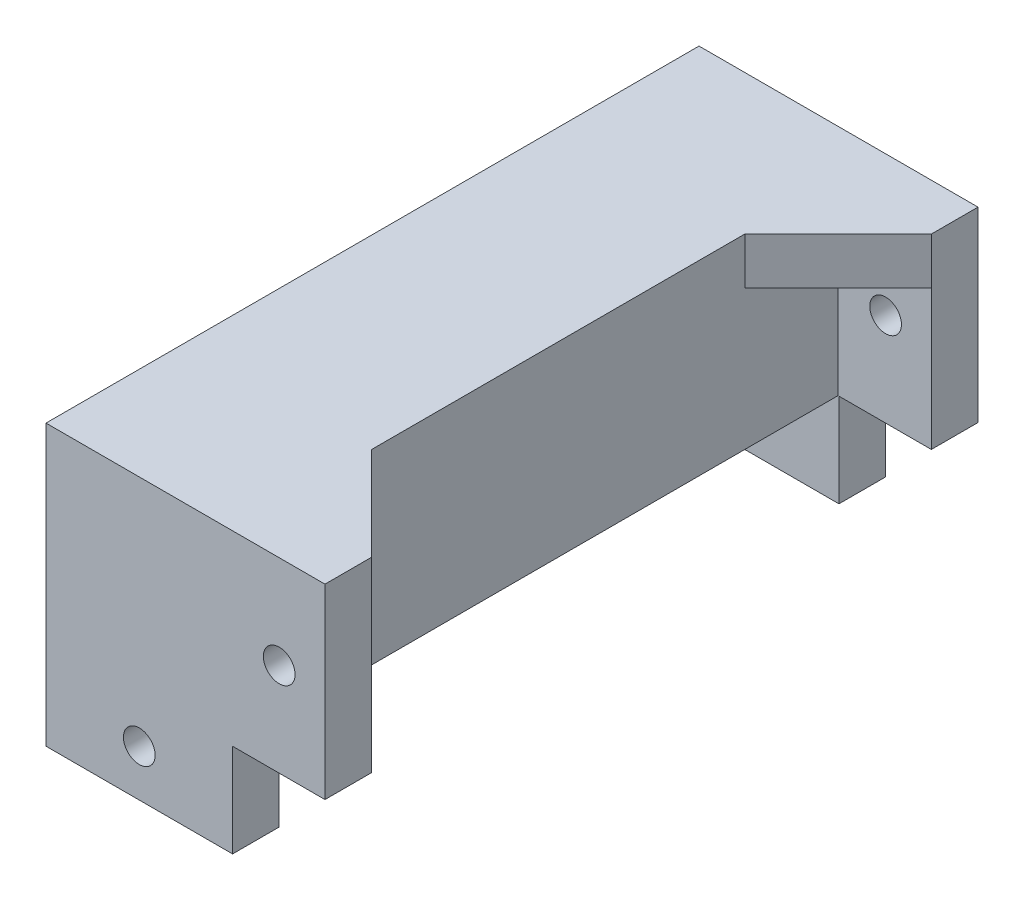
ISO-10303-21;
HEADER;
FILE_DESCRIPTION(('STEP AP214'),'2;1');
FILE_NAME('part.step','',(''),(''),'','','');
FILE_SCHEMA(('AUTOMOTIVE_DESIGN { 1 0 10303 214 1 1 1 1 }'));
ENDSEC;
DATA;
#1=APPLICATION_CONTEXT('core data for automotive mechanical design processes');
#2=APPLICATION_PROTOCOL_DEFINITION('international standard','automotive_design',2000,#1);
#3=PRODUCT_CONTEXT('',#1,'mechanical');
#4=PRODUCT('Part','Part','',(#3));
#5=PRODUCT_RELATED_PRODUCT_CATEGORY('part','',(#4));
#6=PRODUCT_DEFINITION_FORMATION('','',#4);
#7=PRODUCT_DEFINITION_CONTEXT('part definition',#1,'design');
#8=PRODUCT_DEFINITION('design','',#6,#7);
#9=PRODUCT_DEFINITION_SHAPE('','',#8);
#10=(LENGTH_UNIT() NAMED_UNIT(*) SI_UNIT(.MILLI.,.METRE.));
#11=(NAMED_UNIT(*) PLANE_ANGLE_UNIT() SI_UNIT($,.RADIAN.));
#12=(NAMED_UNIT(*) SI_UNIT($,.STERADIAN.) SOLID_ANGLE_UNIT());
#13=UNCERTAINTY_MEASURE_WITH_UNIT(LENGTH_MEASURE(1.E-05),#10,'distance_accuracy_value','');
#14=(GEOMETRIC_REPRESENTATION_CONTEXT(3) GLOBAL_UNCERTAINTY_ASSIGNED_CONTEXT((#13)) GLOBAL_UNIT_ASSIGNED_CONTEXT((#10,
#11,#12)) REPRESENTATION_CONTEXT('',''));
#15=CARTESIAN_POINT('',(0.,0.,0.));
#16=DIRECTION('',(0.,0.,1.));
#17=DIRECTION('',(1.,0.,0.));
#18=AXIS2_PLACEMENT_3D('',#15,#16,#17);
#19=CARTESIAN_POINT('',(-17.5534142595707,0.,311.476360497273));
#20=DIRECTION('',(0.,0.,-1.));
#21=DIRECTION('',(-1.,0.,0.));
#22=AXIS2_PLACEMENT_3D('',#19,#20,#21);
#23=PLANE('',#22);
#24=CARTESIAN_POINT('',(-32.5534142595703,280.43525769972,311.476360497273));
#25=DIRECTION('',(0.,0.,-1.));
#26=DIRECTION('',(-1.,0.,0.));
#27=AXIS2_PLACEMENT_3D('',#24,#25,#26);
#28=CIRCLE('',#27,1.69999999999996);
#29=CARTESIAN_POINT('',(-34.2534142595702,280.43525769972,311.476360497273));
#30=VERTEX_POINT('',#29);
#31=EDGE_CURVE('E327',#30,#30,#28,.T.);
#32=ORIENTED_EDGE('',*,*,#31,.F.);
#33=EDGE_LOOP('',(#32));
#34=FACE_BOUND('',#33,.T.);
#35=CARTESIAN_POINT('',(-17.5534142595702,295.43525769972,311.476360497273));
#36=DIRECTION('',(0.,0.,1.));
#37=DIRECTION('',(1.,0.,0.));
#38=AXIS2_PLACEMENT_3D('',#35,#36,#37);
#39=CIRCLE('',#38,1.69999999999996);
#40=CARTESIAN_POINT('',(-15.8534142595703,295.43525769972,311.476360497273));
#41=VERTEX_POINT('',#40);
#42=EDGE_CURVE('E277',#41,#41,#39,.T.);
#43=ORIENTED_EDGE('',*,*,#42,.T.);
#44=EDGE_LOOP('',(#43));
#45=FACE_BOUND('',#44,.T.);
#46=DIRECTION('',(0.,1.,0.));
#47=VECTOR('',#46,1.);
#48=CARTESIAN_POINT('',(-22.6492691858849,285.43525769972,311.476360497273));
#49=LINE('',#48,#47);
#50=CARTESIAN_POINT('',(-22.6492691858849,285.43525769972,311.476360497273));
#51=VERTEX_POINT('',#50);
#52=CARTESIAN_POINT('',(-22.6492691858849,300.43525769972,311.476360497273));
#53=VERTEX_POINT('',#52);
#54=EDGE_CURVE('E265',#51,#53,#49,.T.);
#55=ORIENTED_EDGE('',*,*,#54,.T.);
#56=DIRECTION('',(1.,0.,0.));
#57=VECTOR('',#56,1.);
#58=CARTESIAN_POINT('',(-17.5534142595707,300.43525769972,311.476360497273));
#59=LINE('',#58,#57);
#60=CARTESIAN_POINT('',(-12.6492691858849,300.43525769972,311.476360497273));
#61=VERTEX_POINT('',#60);
#62=EDGE_CURVE('E256',#53,#61,#59,.T.);
#63=ORIENTED_EDGE('',*,*,#62,.T.);
#64=DIRECTION('',(0.,1.,0.));
#65=VECTOR('',#64,1.);
#66=CARTESIAN_POINT('',(-12.6492691858849,285.43525769972,311.476360497273));
#67=LINE('',#66,#65);
#68=CARTESIAN_POINT('',(-12.6492691858849,285.43525769972,311.476360497273));
#69=VERTEX_POINT('',#68);
#70=EDGE_CURVE('E262',#69,#61,#67,.T.);
#71=ORIENTED_EDGE('',*,*,#70,.F.);
#72=DIRECTION('',(1.,0.,0.));
#73=VECTOR('',#72,1.);
#74=CARTESIAN_POINT('',(0.,285.43525769972,311.476360497273));
#75=LINE('',#74,#73);
#76=CARTESIAN_POINT('',(-22.5534142595703,285.43525769972,311.476360497273));
#77=VERTEX_POINT('',#76);
#78=EDGE_CURVE('E285',#77,#69,#75,.T.);
#79=ORIENTED_EDGE('',*,*,#78,.F.);
#80=DIRECTION('',(0.,1.,0.));
#81=VECTOR('',#80,1.);
#82=CARTESIAN_POINT('',(-22.5534142595703,285.43525769972,311.476360497273));
#83=LINE('',#82,#81);
#84=CARTESIAN_POINT('',(-22.5534142595703,275.43525769972,311.476360497273));
#85=VERTEX_POINT('',#84);
#86=EDGE_CURVE('E324',#85,#77,#83,.T.);
#87=ORIENTED_EDGE('',*,*,#86,.F.);
#88=DIRECTION('',(1.,0.,0.));
#89=VECTOR('',#88,1.);
#90=CARTESIAN_POINT('',(-22.5534142595703,275.43525769972,311.476360497273));
#91=LINE('',#90,#89);
#92=CARTESIAN_POINT('',(-37.5534142595707,275.43525769972,311.476360497273));
#93=VERTEX_POINT('',#92);
#94=EDGE_CURVE('E395',#93,#85,#91,.T.);
#95=ORIENTED_EDGE('',*,*,#94,.F.);
#96=DIRECTION('',(0.,1.,0.));
#97=VECTOR('',#96,1.);
#98=CARTESIAN_POINT('',(-37.5534142595707,0.,311.476360497273));
#99=LINE('',#98,#97);
#100=CARTESIAN_POINT('',(-37.5534142595707,285.43525769972,311.476360497273));
#101=VERTEX_POINT('',#100);
#102=EDGE_CURVE('E308',#93,#101,#99,.T.);
#103=ORIENTED_EDGE('',*,*,#102,.T.);
#104=DIRECTION('',(-1.,0.,0.));
#105=VECTOR('',#104,1.);
#106=CARTESIAN_POINT('',(-17.5534142595707,285.43525769972,311.476360497273));
#107=LINE('',#106,#105);
#108=EDGE_CURVE('E315',#51,#101,#107,.T.);
#109=ORIENTED_EDGE('',*,*,#108,.F.);
#110=EDGE_LOOP('',(#55,#63,#71,#79,#87,#95,#103,#109));
#111=FACE_BOUND('',#110,.T.);
#112=ADVANCED_FACE('F103',(#34,#45,#111),#23,.T.);
#113=CARTESIAN_POINT('',(-17.5534142595707,0.,251.476360497273));
#114=DIRECTION('',(0.,0.,-1.));
#115=DIRECTION('',(-1.,0.,0.));
#116=AXIS2_PLACEMENT_3D('',#113,#114,#115);
#117=PLANE('',#116);
#118=CARTESIAN_POINT('',(-17.5534142595702,295.43525769972,251.476360497273));
#119=DIRECTION('',(0.,0.,1.));
#120=DIRECTION('',(1.,0.,0.));
#121=AXIS2_PLACEMENT_3D('',#118,#119,#120);
#122=CIRCLE('',#121,1.69999999999996);
#123=CARTESIAN_POINT('',(-15.8534142595703,295.43525769972,251.476360497273));
#124=VERTEX_POINT('',#123);
#125=EDGE_CURVE('E288',#124,#124,#122,.T.);
#126=ORIENTED_EDGE('',*,*,#125,.F.);
#127=EDGE_LOOP('',(#126));
#128=FACE_BOUND('',#127,.T.);
#129=CARTESIAN_POINT('',(-32.5534142595703,280.43525769972,251.476360497273));
#130=DIRECTION('',(0.,0.,-1.));
#131=DIRECTION('',(-1.,0.,0.));
#132=AXIS2_PLACEMENT_3D('',#129,#130,#131);
#133=CIRCLE('',#132,1.69999999999996);
#134=CARTESIAN_POINT('',(-34.2534142595702,280.43525769972,251.476360497273));
#135=VERTEX_POINT('',#134);
#136=EDGE_CURVE('E321',#135,#135,#133,.T.);
#137=ORIENTED_EDGE('',*,*,#136,.T.);
#138=EDGE_LOOP('',(#137));
#139=FACE_BOUND('',#138,.T.);
#140=DIRECTION('',(1.,0.,0.));
#141=VECTOR('',#140,1.);
#142=CARTESIAN_POINT('',(-17.5534142595707,300.43525769972,251.476360497273));
#143=LINE('',#142,#141);
#144=CARTESIAN_POINT('',(-22.6492691858849,300.43525769972,251.476360497273));
#145=VERTEX_POINT('',#144);
#146=CARTESIAN_POINT('',(-12.6492691858849,300.43525769972,251.476360497273));
#147=VERTEX_POINT('',#146);
#148=EDGE_CURVE('E266',#145,#147,#143,.T.);
#149=ORIENTED_EDGE('',*,*,#148,.F.);
#150=DIRECTION('',(0.,1.,0.));
#151=VECTOR('',#150,1.);
#152=CARTESIAN_POINT('',(-22.6492691858849,285.43525769972,251.476360497273));
#153=LINE('',#152,#151);
#154=CARTESIAN_POINT('',(-22.6492691858849,285.43525769972,251.476360497273));
#155=VERTEX_POINT('',#154);
#156=EDGE_CURVE('E279',#155,#145,#153,.T.);
#157=ORIENTED_EDGE('',*,*,#156,.F.);
#158=DIRECTION('',(-1.,0.,0.));
#159=VECTOR('',#158,1.);
#160=CARTESIAN_POINT('',(-17.5534142595707,285.43525769972,251.476360497273));
#161=LINE('',#160,#159);
#162=CARTESIAN_POINT('',(-37.5534142595707,285.43525769972,251.476360497273));
#163=VERTEX_POINT('',#162);
#164=EDGE_CURVE('E314',#155,#163,#161,.T.);
#165=ORIENTED_EDGE('',*,*,#164,.T.);
#166=DIRECTION('',(0.,1.,0.));
#167=VECTOR('',#166,1.);
#168=CARTESIAN_POINT('',(-37.5534142595707,0.,251.476360497273));
#169=LINE('',#168,#167);
#170=CARTESIAN_POINT('',(-37.5534142595707,275.43525769972,251.476360497273));
#171=VERTEX_POINT('',#170);
#172=EDGE_CURVE('E398',#171,#163,#169,.T.);
#173=ORIENTED_EDGE('',*,*,#172,.F.);
#174=DIRECTION('',(1.,0.,0.));
#175=VECTOR('',#174,1.);
#176=CARTESIAN_POINT('',(-22.5534142595703,275.43525769972,251.476360497273));
#177=LINE('',#176,#175);
#178=CARTESIAN_POINT('',(-22.5534142595703,275.43525769972,251.476360497273));
#179=VERTEX_POINT('',#178);
#180=EDGE_CURVE('E367',#171,#179,#177,.T.);
#181=ORIENTED_EDGE('',*,*,#180,.T.);
#182=DIRECTION('',(0.,1.,0.));
#183=VECTOR('',#182,1.);
#184=CARTESIAN_POINT('',(-22.5534142595703,285.43525769972,251.476360497273));
#185=LINE('',#184,#183);
#186=CARTESIAN_POINT('',(-22.5534142595703,285.43525769972,251.476360497273));
#187=VERTEX_POINT('',#186);
#188=EDGE_CURVE('E317',#179,#187,#185,.T.);
#189=ORIENTED_EDGE('',*,*,#188,.T.);
#190=DIRECTION('',(1.,0.,0.));
#191=VECTOR('',#190,1.);
#192=CARTESIAN_POINT('',(0.,285.43525769972,251.476360497273));
#193=LINE('',#192,#191);
#194=CARTESIAN_POINT('',(-12.6492691858849,285.43525769972,251.476360497273));
#195=VERTEX_POINT('',#194);
#196=EDGE_CURVE('E414',#187,#195,#193,.T.);
#197=ORIENTED_EDGE('',*,*,#196,.T.);
#198=DIRECTION('',(0.,1.,0.));
#199=VECTOR('',#198,1.);
#200=CARTESIAN_POINT('',(-12.6492691858849,285.43525769972,251.476360497273));
#201=LINE('',#200,#199);
#202=EDGE_CURVE('E274',#195,#147,#201,.T.);
#203=ORIENTED_EDGE('',*,*,#202,.T.);
#204=EDGE_LOOP('',(#149,#157,#165,#173,#181,#189,#197,#203));
#205=FACE_BOUND('',#204,.T.);
#206=ADVANCED_FACE('F470',(#128,#139,#205),#117,.F.);
#207=CARTESIAN_POINT('',(-17.5534142595702,295.43525769972,316.476360497273));
#208=DIRECTION('',(0.,0.,-1.));
#209=DIRECTION('',(-1.,0.,0.));
#210=AXIS2_PLACEMENT_3D('',#207,#208,#209);
#211=CYLINDRICAL_SURFACE('',#210,1.69999999999996);
#212=CARTESIAN_POINT('',(-17.5534142595702,295.43525769972,246.476360497273));
#213=DIRECTION('',(0.,0.,1.));
#214=DIRECTION('',(1.,0.,0.));
#215=AXIS2_PLACEMENT_3D('',#212,#213,#214);
#216=CIRCLE('',#215,1.69999999999996);
#217=CARTESIAN_POINT('',(-15.8534142595703,295.43525769972,246.476360497273));
#218=VERTEX_POINT('',#217);
#219=EDGE_CURVE('E344',#218,#218,#216,.T.);
#220=ORIENTED_EDGE('',*,*,#219,.F.);
#221=EDGE_LOOP('',(#220));
#222=FACE_BOUND('',#221,.T.);
#223=ORIENTED_EDGE('',*,*,#125,.T.);
#224=EDGE_LOOP('',(#223));
#225=FACE_BOUND('',#224,.T.);
#226=ADVANCED_FACE('F491',(#222,#225),#211,.F.);
#227=CARTESIAN_POINT('',(-12.6492691858849,0.,316.476360497273));
#228=DIRECTION('',(-1.,0.,0.));
#229=DIRECTION('',(0.,0.,1.));
#230=AXIS2_PLACEMENT_3D('',#227,#228,#229);
#231=PLANE('',#230);
#232=DIRECTION('',(0.,1.,0.));
#233=VECTOR('',#232,1.);
#234=CARTESIAN_POINT('',(-12.6492691858849,300.43525769972,251.476360497273));
#235=LINE('',#234,#233);
#236=CARTESIAN_POINT('',(-12.6492691858849,305.43525769972,251.476360497273));
#237=VERTEX_POINT('',#236);
#238=EDGE_CURVE('E267',#147,#237,#235,.T.);
#239=ORIENTED_EDGE('',*,*,#238,.F.);
#240=ORIENTED_EDGE('',*,*,#202,.F.);
#241=DIRECTION('',(0.,0.,-1.));
#242=VECTOR('',#241,1.);
#243=CARTESIAN_POINT('',(-12.6492691858849,285.43525769972,316.476360497273));
#244=LINE('',#243,#242);
#245=CARTESIAN_POINT('',(-12.6492691858849,285.43525769972,246.476360497273));
#246=VERTEX_POINT('',#245);
#247=EDGE_CURVE('E361',#195,#246,#244,.T.);
#248=ORIENTED_EDGE('',*,*,#247,.T.);
#249=DIRECTION('',(0.,1.,0.));
#250=VECTOR('',#249,1.);
#251=CARTESIAN_POINT('',(-12.6492691858849,0.,246.476360497273));
#252=LINE('',#251,#250);
#253=CARTESIAN_POINT('',(-12.6492691858849,305.43525769972,246.476360497273));
#254=VERTEX_POINT('',#253);
#255=EDGE_CURVE('E351',#246,#254,#252,.T.);
#256=ORIENTED_EDGE('',*,*,#255,.T.);
#257=DIRECTION('',(0.,0.,-1.));
#258=VECTOR('',#257,1.);
#259=CARTESIAN_POINT('',(-12.6492691858849,305.43525769972,316.476360497273));
#260=LINE('',#259,#258);
#261=EDGE_CURVE('E358',#237,#254,#260,.T.);
#262=ORIENTED_EDGE('',*,*,#261,.F.);
#263=EDGE_LOOP('',(#239,#240,#248,#256,#262));
#264=FACE_BOUND('',#263,.T.);
#265=ADVANCED_FACE('F427',(#264),#231,.F.);
#266=CARTESIAN_POINT('',(0.,285.43525769972,316.476360497273));
#267=DIRECTION('',(0.,1.,0.));
#268=DIRECTION('',(0.,0.,1.));
#269=AXIS2_PLACEMENT_3D('',#266,#267,#268);
#270=PLANE('',#269);
#271=ORIENTED_EDGE('',*,*,#196,.F.);
#272=DIRECTION('',(0.,0.,-1.));
#273=VECTOR('',#272,1.);
#274=CARTESIAN_POINT('',(-22.5534142595703,285.43525769972,316.476360497273));
#275=LINE('',#274,#273);
#276=CARTESIAN_POINT('',(-22.5534142595703,285.43525769972,246.476360497273));
#277=VERTEX_POINT('',#276);
#278=EDGE_CURVE('E363',#187,#277,#275,.T.);
#279=ORIENTED_EDGE('',*,*,#278,.T.);
#280=DIRECTION('',(1.,0.,0.));
#281=VECTOR('',#280,1.);
#282=CARTESIAN_POINT('',(0.,285.43525769972,246.476360497273));
#283=LINE('',#282,#281);
#284=EDGE_CURVE('E347',#277,#246,#283,.T.);
#285=ORIENTED_EDGE('',*,*,#284,.T.);
#286=ORIENTED_EDGE('',*,*,#247,.F.);
#287=EDGE_LOOP('',(#271,#279,#285,#286));
#288=FACE_BOUND('',#287,.T.);
#289=ADVANCED_FACE('F515',(#288),#270,.F.);
#290=DIRECTION('',(0.,0.,-1.));
#291=VECTOR('',#290,1.);
#292=CARTESIAN_POINT('',(-22.6492691858849,285.43525769972,0.));
#293=LINE('',#292,#291);
#294=EDGE_CURVE('E416',#51,#155,#293,.T.);
#295=ORIENTED_EDGE('',*,*,#294,.F.);
#296=ORIENTED_EDGE('',*,*,#108,.T.);
#297=DIRECTION('',(0.,0.,1.));
#298=VECTOR('',#297,1.);
#299=CARTESIAN_POINT('',(-37.5534142595707,285.43525769972,316.476360497273));
#300=LINE('',#299,#298);
#301=CARTESIAN_POINT('',(-37.5534142595707,285.43525769972,301.476360497273));
#302=VERTEX_POINT('',#301);
#303=EDGE_CURVE('E309',#302,#101,#300,.T.);
#304=ORIENTED_EDGE('',*,*,#303,.F.);
#305=DIRECTION('',(-1.,0.,0.));
#306=VECTOR('',#305,1.);
#307=CARTESIAN_POINT('',(-37.5534142595707,285.43525769972,301.476360497273));
#308=LINE('',#307,#306);
#309=CARTESIAN_POINT('',(-42.5534142595707,285.43525769972,301.476360497273));
#310=VERTEX_POINT('',#309);
#311=EDGE_CURVE('E302',#302,#310,#308,.T.);
#312=ORIENTED_EDGE('',*,*,#311,.T.);
#313=DIRECTION('',(0.,0.,-1.));
#314=VECTOR('',#313,1.);
#315=CARTESIAN_POINT('',(-42.5534142595707,285.43525769972,0.));
#316=LINE('',#315,#314);
#317=CARTESIAN_POINT('',(-42.5534142595707,285.43525769972,261.476360497273));
#318=VERTEX_POINT('',#317);
#319=EDGE_CURVE('E312',#310,#318,#316,.T.);
#320=ORIENTED_EDGE('',*,*,#319,.T.);
#321=DIRECTION('',(-1.,0.,0.));
#322=VECTOR('',#321,1.);
#323=CARTESIAN_POINT('',(-37.5534142595707,285.43525769972,261.476360497273));
#324=LINE('',#323,#322);
#325=CARTESIAN_POINT('',(-37.5534142595707,285.43525769972,261.476360497273));
#326=VERTEX_POINT('',#325);
#327=EDGE_CURVE('E126',#326,#318,#324,.T.);
#328=ORIENTED_EDGE('',*,*,#327,.F.);
#329=EDGE_CURVE('E305',#163,#326,#300,.T.);
#330=ORIENTED_EDGE('',*,*,#329,.F.);
#331=ORIENTED_EDGE('',*,*,#164,.F.);
#332=EDGE_LOOP('',(#295,#296,#304,#312,#320,#328,#330,#331));
#333=FACE_BOUND('',#332,.T.);
#334=ADVANCED_FACE('F464',(#333),#270,.F.);
#335=CARTESIAN_POINT('',(0.,305.43525769972,316.476360497273));
#336=DIRECTION('',(0.,-1.,0.));
#337=DIRECTION('',(0.,0.,-1.));
#338=AXIS2_PLACEMENT_3D('',#335,#336,#337);
#339=PLANE('',#338);
#340=CARTESIAN_POINT('',(-12.6492691858849,305.43525769972,316.476360497273));
#341=VERTEX_POINT('',#340);
#342=CARTESIAN_POINT('',(-12.6492691858849,305.43525769972,311.476360497273));
#343=VERTEX_POINT('',#342);
#344=EDGE_CURVE('E359',#341,#343,#260,.T.);
#345=ORIENTED_EDGE('',*,*,#344,.T.);
#346=DIRECTION('',(-0.707106781186551,0.,-0.707106781186544));
#347=VECTOR('',#346,1.);
#348=CARTESIAN_POINT('',(-12.6492691858849,305.43525769972,311.476360497273));
#349=LINE('',#348,#347);
#350=CARTESIAN_POINT('',(-22.6492691858849,305.43525769972,301.476360497273));
#351=VERTEX_POINT('',#350);
#352=EDGE_CURVE('E118',#343,#351,#349,.T.);
#353=ORIENTED_EDGE('',*,*,#352,.T.);
#354=DIRECTION('',(0.,0.,-1.));
#355=VECTOR('',#354,1.);
#356=CARTESIAN_POINT('',(-22.6492691858849,305.43525769972,0.));
#357=LINE('',#356,#355);
#358=CARTESIAN_POINT('',(-22.6492691858849,305.43525769972,261.476360497273));
#359=VERTEX_POINT('',#358);
#360=EDGE_CURVE('E407',#351,#359,#357,.T.);
#361=ORIENTED_EDGE('',*,*,#360,.T.);
#362=DIRECTION('',(0.707106781186541,0.,-0.707106781186554));
#363=VECTOR('',#362,1.);
#364=CARTESIAN_POINT('',(-12.6492691858849,305.43525769972,251.476360497273));
#365=LINE('',#364,#363);
#366=EDGE_CURVE('E258',#359,#237,#365,.T.);
#367=ORIENTED_EDGE('',*,*,#366,.T.);
#368=ORIENTED_EDGE('',*,*,#261,.T.);
#369=DIRECTION('',(-1.,0.,0.));
#370=VECTOR('',#369,1.);
#371=CARTESIAN_POINT('',(0.,305.43525769972,246.476360497273));
#372=LINE('',#371,#370);
#373=CARTESIAN_POINT('',(-42.5534142595703,305.43525769972,246.476360497273));
#374=VERTEX_POINT('',#373);
#375=EDGE_CURVE('E353',#254,#374,#372,.T.);
#376=ORIENTED_EDGE('',*,*,#375,.T.);
#377=DIRECTION('',(0.,0.,-1.));
#378=VECTOR('',#377,1.);
#379=CARTESIAN_POINT('',(-42.5534142595703,305.43525769972,316.476360497273));
#380=LINE('',#379,#378);
#381=CARTESIAN_POINT('',(-42.5534142595703,305.43525769972,316.476360497273));
#382=VERTEX_POINT('',#381);
#383=EDGE_CURVE('E343',#382,#374,#380,.T.);
#384=ORIENTED_EDGE('',*,*,#383,.F.);
#385=DIRECTION('',(-1.,0.,0.));
#386=VECTOR('',#385,1.);
#387=CARTESIAN_POINT('',(0.,305.43525769972,316.476360497273));
#388=LINE('',#387,#386);
#389=EDGE_CURVE('E339',#341,#382,#388,.T.);
#390=ORIENTED_EDGE('',*,*,#389,.F.);
#391=EDGE_LOOP('',(#345,#353,#361,#367,#368,#376,#384,#390));
#392=FACE_BOUND('',#391,.T.);
#393=ADVANCED_FACE('F419',(#392),#339,.F.);
#394=CARTESIAN_POINT('',(-42.5534142595707,0.,316.476360497273));
#395=DIRECTION('',(1.,0.,0.));
#396=DIRECTION('',(0.,1.,0.));
#397=AXIS2_PLACEMENT_3D('',#394,#395,#396);
#398=PLANE('',#397);
#399=DIRECTION('',(0.,-1.,0.));
#400=VECTOR('',#399,1.);
#401=CARTESIAN_POINT('',(-42.5534142595707,0.,246.476360497273));
#402=LINE('',#401,#400);
#403=CARTESIAN_POINT('',(-42.5534142595703,275.43525769972,246.476360497273));
#404=VERTEX_POINT('',#403);
#405=EDGE_CURVE('E335',#374,#404,#402,.T.);
#406=ORIENTED_EDGE('',*,*,#405,.T.);
#407=DIRECTION('',(0.,0.,-1.));
#408=VECTOR('',#407,1.);
#409=CARTESIAN_POINT('',(-42.5534142595703,275.43525769972,316.476360497273));
#410=LINE('',#409,#408);
#411=CARTESIAN_POINT('',(-42.5534142595707,275.43525769972,251.476360497273));
#412=VERTEX_POINT('',#411);
#413=EDGE_CURVE('E381',#412,#404,#410,.T.);
#414=ORIENTED_EDGE('',*,*,#413,.F.);
#415=DIRECTION('',(0.,0.707106781186549,0.707106781186545));
#416=VECTOR('',#415,1.);
#417=CARTESIAN_POINT('',(-42.5534142595707,275.43525769972,251.476360497273));
#418=LINE('',#417,#416);
#419=EDGE_CURVE('E291',#412,#318,#418,.T.);
#420=ORIENTED_EDGE('',*,*,#419,.T.);
#421=ORIENTED_EDGE('',*,*,#319,.F.);
#422=DIRECTION('',(0.,-0.707106781186546,0.707106781186549));
#423=VECTOR('',#422,1.);
#424=CARTESIAN_POINT('',(-42.5534142595707,275.43525769972,311.476360497273));
#425=LINE('',#424,#423);
#426=CARTESIAN_POINT('',(-42.5534142595707,275.43525769972,311.476360497273));
#427=VERTEX_POINT('',#426);
#428=EDGE_CURVE('E296',#310,#427,#425,.T.);
#429=ORIENTED_EDGE('',*,*,#428,.T.);
#430=CARTESIAN_POINT('',(-42.5534142595703,275.43525769972,316.476360497273));
#431=VERTEX_POINT('',#430);
#432=EDGE_CURVE('E389',#431,#427,#410,.T.);
#433=ORIENTED_EDGE('',*,*,#432,.F.);
#434=DIRECTION('',(0.,-1.,0.));
#435=VECTOR('',#434,1.);
#436=CARTESIAN_POINT('',(-42.5534142595707,0.,316.476360497273));
#437=LINE('',#436,#435);
#438=EDGE_CURVE('E341',#382,#431,#437,.T.);
#439=ORIENTED_EDGE('',*,*,#438,.F.);
#440=ORIENTED_EDGE('',*,*,#383,.T.);
#441=EDGE_LOOP('',(#406,#414,#420,#421,#429,#433,#439,#440));
#442=FACE_BOUND('',#441,.T.);
#443=ADVANCED_FACE('F440',(#442),#398,.F.);
#444=CARTESIAN_POINT('',(-32.5534142595703,280.43525769972,316.476360497273));
#445=DIRECTION('',(0.,0.,-1.));
#446=DIRECTION('',(-1.,0.,0.));
#447=AXIS2_PLACEMENT_3D('',#444,#445,#446);
#448=CYLINDRICAL_SURFACE('',#447,1.69999999999996);
#449=CARTESIAN_POINT('',(-32.5534142595703,280.43525769972,316.476360497273));
#450=DIRECTION('',(0.,0.,1.));
#451=DIRECTION('',(1.,0.,0.));
#452=AXIS2_PLACEMENT_3D('',#449,#450,#451);
#453=CIRCLE('',#452,1.69999999999996);
#454=CARTESIAN_POINT('',(-30.8534142595703,280.43525769972,316.476360497273));
#455=VERTEX_POINT('',#454);
#456=EDGE_CURVE('E368',#455,#455,#453,.T.);
#457=ORIENTED_EDGE('',*,*,#456,.T.);
#458=EDGE_LOOP('',(#457));
#459=FACE_BOUND('',#458,.T.);
#460=ORIENTED_EDGE('',*,*,#31,.T.);
#461=EDGE_LOOP('',(#460));
#462=FACE_BOUND('',#461,.T.);
#463=ADVANCED_FACE('F508',(#459,#462),#448,.F.);
#464=CARTESIAN_POINT('',(-22.5534142595703,285.43525769972,316.476360497273));
#465=DIRECTION('',(1.,0.,0.));
#466=DIRECTION('',(0.,0.,-1.));
#467=AXIS2_PLACEMENT_3D('',#464,#465,#466);
#468=PLANE('',#467);
#469=DIRECTION('',(0.,0.,-1.));
#470=VECTOR('',#469,1.);
#471=CARTESIAN_POINT('',(-22.5534142595703,275.43525769972,316.476360497273));
#472=LINE('',#471,#470);
#473=CARTESIAN_POINT('',(-22.5534142595703,275.43525769972,316.476360497273));
#474=VERTEX_POINT('',#473);
#475=EDGE_CURVE('E348',#474,#85,#472,.T.);
#476=ORIENTED_EDGE('',*,*,#475,.T.);
#477=ORIENTED_EDGE('',*,*,#86,.T.);
#478=CARTESIAN_POINT('',(-22.5534142595703,285.43525769972,316.476360497273));
#479=VERTEX_POINT('',#478);
#480=EDGE_CURVE('E364',#479,#77,#275,.T.);
#481=ORIENTED_EDGE('',*,*,#480,.F.);
#482=DIRECTION('',(0.,-1.,0.));
#483=VECTOR('',#482,1.);
#484=CARTESIAN_POINT('',(-22.5534142595703,285.43525769972,316.476360497273));
#485=LINE('',#484,#483);
#486=EDGE_CURVE('E377',#479,#474,#485,.T.);
#487=ORIENTED_EDGE('',*,*,#486,.T.);
#488=EDGE_LOOP('',(#476,#477,#481,#487));
#489=FACE_BOUND('',#488,.T.);
#490=ADVANCED_FACE('F452',(#489),#468,.T.);
#491=CARTESIAN_POINT('',(-22.5534142595703,275.43525769972,316.476360497273));
#492=DIRECTION('',(0.,-1.,0.));
#493=DIRECTION('',(0.,0.,-1.));
#494=AXIS2_PLACEMENT_3D('',#491,#492,#493);
#495=PLANE('',#494);
#496=EDGE_CURVE('E396',#427,#93,#91,.T.);
#497=ORIENTED_EDGE('',*,*,#496,.T.);
#498=ORIENTED_EDGE('',*,*,#94,.T.);
#499=ORIENTED_EDGE('',*,*,#475,.F.);
#500=DIRECTION('',(-1.,0.,0.));
#501=VECTOR('',#500,1.);
#502=CARTESIAN_POINT('',(-22.5534142595703,275.43525769972,316.476360497273));
#503=LINE('',#502,#501);
#504=EDGE_CURVE('E374',#474,#431,#503,.T.);
#505=ORIENTED_EDGE('',*,*,#504,.T.);
#506=ORIENTED_EDGE('',*,*,#432,.T.);
#507=EDGE_LOOP('',(#497,#498,#499,#505,#506));
#508=FACE_BOUND('',#507,.T.);
#509=ADVANCED_FACE('F448',(#508),#495,.T.);
#510=ORIENTED_EDGE('',*,*,#42,.F.);
#511=EDGE_LOOP('',(#510));
#512=FACE_BOUND('',#511,.T.);
#513=CARTESIAN_POINT('',(-17.5534142595702,295.43525769972,316.476360497273));
#514=DIRECTION('',(0.,0.,1.));
#515=DIRECTION('',(1.,0.,0.));
#516=AXIS2_PLACEMENT_3D('',#513,#514,#515);
#517=CIRCLE('',#516,1.69999999999996);
#518=CARTESIAN_POINT('',(-15.8534142595703,295.43525769972,316.476360497273));
#519=VERTEX_POINT('',#518);
#520=EDGE_CURVE('E331',#519,#519,#517,.T.);
#521=ORIENTED_EDGE('',*,*,#520,.T.);
#522=EDGE_LOOP('',(#521));
#523=FACE_BOUND('',#522,.T.);
#524=ADVANCED_FACE('F503',(#512,#523),#211,.F.);
#525=ORIENTED_EDGE('',*,*,#344,.F.);
#526=DIRECTION('',(0.,1.,0.));
#527=VECTOR('',#526,1.);
#528=CARTESIAN_POINT('',(-12.6492691858849,0.,316.476360497273));
#529=LINE('',#528,#527);
#530=CARTESIAN_POINT('',(-12.6492691858849,285.43525769972,316.476360497273));
#531=VERTEX_POINT('',#530);
#532=EDGE_CURVE('E337',#531,#341,#529,.T.);
#533=ORIENTED_EDGE('',*,*,#532,.F.);
#534=EDGE_CURVE('E273',#531,#69,#244,.T.);
#535=ORIENTED_EDGE('',*,*,#534,.T.);
#536=ORIENTED_EDGE('',*,*,#70,.T.);
#537=DIRECTION('',(0.,1.,0.));
#538=VECTOR('',#537,1.);
#539=CARTESIAN_POINT('',(-12.6492691858849,300.43525769972,311.476360497273));
#540=LINE('',#539,#538);
#541=EDGE_CURVE('E242',#61,#343,#540,.T.);
#542=ORIENTED_EDGE('',*,*,#541,.T.);
#543=EDGE_LOOP('',(#525,#533,#535,#536,#542));
#544=FACE_BOUND('',#543,.T.);
#545=ADVANCED_FACE('F270',(#544),#231,.F.);
#546=ORIENTED_EDGE('',*,*,#480,.T.);
#547=ORIENTED_EDGE('',*,*,#78,.T.);
#548=ORIENTED_EDGE('',*,*,#534,.F.);
#549=DIRECTION('',(1.,0.,0.));
#550=VECTOR('',#549,1.);
#551=CARTESIAN_POINT('',(0.,285.43525769972,316.476360497273));
#552=LINE('',#551,#550);
#553=EDGE_CURVE('E334',#479,#531,#552,.T.);
#554=ORIENTED_EDGE('',*,*,#553,.F.);
#555=EDGE_LOOP('',(#546,#547,#548,#554));
#556=FACE_BOUND('',#555,.T.);
#557=ADVANCED_FACE('F455',(#556),#270,.F.);
#558=CARTESIAN_POINT('',(0.,0.,246.476360497273));
#559=DIRECTION('',(0.,0.,1.));
#560=DIRECTION('',(1.,0.,0.));
#561=AXIS2_PLACEMENT_3D('',#558,#559,#560);
#562=PLANE('',#561);
#563=ORIENTED_EDGE('',*,*,#375,.F.);
#564=ORIENTED_EDGE('',*,*,#255,.F.);
#565=ORIENTED_EDGE('',*,*,#284,.F.);
#566=DIRECTION('',(0.,-1.,0.));
#567=VECTOR('',#566,1.);
#568=CARTESIAN_POINT('',(-22.5534142595703,285.43525769972,246.476360497273));
#569=LINE('',#568,#567);
#570=CARTESIAN_POINT('',(-22.5534142595703,275.43525769972,246.476360497273));
#571=VERTEX_POINT('',#570);
#572=EDGE_CURVE('E378',#277,#571,#569,.T.);
#573=ORIENTED_EDGE('',*,*,#572,.T.);
#574=DIRECTION('',(-1.,0.,0.));
#575=VECTOR('',#574,1.);
#576=CARTESIAN_POINT('',(-22.5534142595703,275.43525769972,246.476360497273));
#577=LINE('',#576,#575);
#578=EDGE_CURVE('E371',#571,#404,#577,.T.);
#579=ORIENTED_EDGE('',*,*,#578,.T.);
#580=ORIENTED_EDGE('',*,*,#405,.F.);
#581=EDGE_LOOP('',(#563,#564,#565,#573,#579,#580));
#582=FACE_BOUND('',#581,.T.);
#583=ORIENTED_EDGE('',*,*,#219,.T.);
#584=EDGE_LOOP('',(#583));
#585=FACE_BOUND('',#584,.T.);
#586=CARTESIAN_POINT('',(-32.5534142595703,280.43525769972,246.476360497273));
#587=DIRECTION('',(0.,0.,1.));
#588=DIRECTION('',(1.,0.,0.));
#589=AXIS2_PLACEMENT_3D('',#586,#587,#588);
#590=CIRCLE('',#589,1.69999999999996);
#591=CARTESIAN_POINT('',(-30.8534142595703,280.43525769972,246.476360497273));
#592=VERTEX_POINT('',#591);
#593=EDGE_CURVE('E330',#592,#592,#590,.T.);
#594=ORIENTED_EDGE('',*,*,#593,.T.);
#595=EDGE_LOOP('',(#594));
#596=FACE_BOUND('',#595,.T.);
#597=ADVANCED_FACE('F433',(#582,#585,#596),#562,.F.);
#598=CARTESIAN_POINT('',(0.,0.,316.476360497273));
#599=DIRECTION('',(0.,0.,1.));
#600=DIRECTION('',(1.,0.,0.));
#601=AXIS2_PLACEMENT_3D('',#598,#599,#600);
#602=PLANE('',#601);
#603=ORIENTED_EDGE('',*,*,#438,.T.);
#604=ORIENTED_EDGE('',*,*,#504,.F.);
#605=ORIENTED_EDGE('',*,*,#486,.F.);
#606=ORIENTED_EDGE('',*,*,#553,.T.);
#607=ORIENTED_EDGE('',*,*,#532,.T.);
#608=ORIENTED_EDGE('',*,*,#389,.T.);
#609=EDGE_LOOP('',(#603,#604,#605,#606,#607,#608));
#610=FACE_BOUND('',#609,.T.);
#611=ORIENTED_EDGE('',*,*,#520,.F.);
#612=EDGE_LOOP('',(#611));
#613=FACE_BOUND('',#612,.T.);
#614=ORIENTED_EDGE('',*,*,#456,.F.);
#615=EDGE_LOOP('',(#614));
#616=FACE_BOUND('',#615,.T.);
#617=ADVANCED_FACE('F444',(#610,#613,#616),#602,.T.);
#618=ORIENTED_EDGE('',*,*,#136,.F.);
#619=EDGE_LOOP('',(#618));
#620=FACE_BOUND('',#619,.T.);
#621=ORIENTED_EDGE('',*,*,#593,.F.);
#622=EDGE_LOOP('',(#621));
#623=FACE_BOUND('',#622,.T.);
#624=ADVANCED_FACE('F502',(#620,#623),#448,.F.);
#625=ORIENTED_EDGE('',*,*,#188,.F.);
#626=EDGE_CURVE('E388',#179,#571,#472,.T.);
#627=ORIENTED_EDGE('',*,*,#626,.T.);
#628=ORIENTED_EDGE('',*,*,#572,.F.);
#629=ORIENTED_EDGE('',*,*,#278,.F.);
#630=EDGE_LOOP('',(#625,#627,#628,#629));
#631=FACE_BOUND('',#630,.T.);
#632=ADVANCED_FACE('F521',(#631),#468,.T.);
#633=ORIENTED_EDGE('',*,*,#413,.T.);
#634=ORIENTED_EDGE('',*,*,#578,.F.);
#635=ORIENTED_EDGE('',*,*,#626,.F.);
#636=ORIENTED_EDGE('',*,*,#180,.F.);
#637=EDGE_CURVE('E392',#412,#171,#177,.T.);
#638=ORIENTED_EDGE('',*,*,#637,.F.);
#639=EDGE_LOOP('',(#633,#634,#635,#636,#638));
#640=FACE_BOUND('',#639,.T.);
#641=ADVANCED_FACE('F105',(#640),#495,.T.);
#642=CARTESIAN_POINT('',(-37.5534142595707,0.,0.));
#643=DIRECTION('',(-1.,0.,0.));
#644=DIRECTION('',(0.,0.,1.));
#645=AXIS2_PLACEMENT_3D('',#642,#643,#644);
#646=PLANE('',#645);
#647=ORIENTED_EDGE('',*,*,#172,.T.);
#648=ORIENTED_EDGE('',*,*,#329,.T.);
#649=DIRECTION('',(0.,0.707106781186549,0.707106781186545));
#650=VECTOR('',#649,1.);
#651=CARTESIAN_POINT('',(-37.5534142595707,275.43525769972,251.476360497273));
#652=LINE('',#651,#650);
#653=EDGE_CURVE('E292',#171,#326,#652,.T.);
#654=ORIENTED_EDGE('',*,*,#653,.F.);
#655=EDGE_LOOP('',(#647,#648,#654));
#656=FACE_BOUND('',#655,.T.);
#657=ADVANCED_FACE('F516',(#656),#646,.F.);
#658=CARTESIAN_POINT('',(-37.5534142595707,275.43525769972,251.476360497273));
#659=DIRECTION('',(0.,-0.707106781186546,0.707106781186549));
#660=DIRECTION('',(0.,-0.707106781186549,-0.707106781186546));
#661=AXIS2_PLACEMENT_3D('',#658,#659,#660);
#662=PLANE('',#661);
#663=ORIENTED_EDGE('',*,*,#419,.F.);
#664=ORIENTED_EDGE('',*,*,#637,.T.);
#665=ORIENTED_EDGE('',*,*,#653,.T.);
#666=ORIENTED_EDGE('',*,*,#327,.T.);
#667=EDGE_LOOP('',(#663,#664,#665,#666));
#668=FACE_BOUND('',#667,.T.);
#669=ADVANCED_FACE('F497',(#668),#662,.T.);
#670=DIRECTION('',(0.,-0.707106781186546,0.707106781186549));
#671=VECTOR('',#670,1.);
#672=CARTESIAN_POINT('',(-37.5534142595707,275.43525769972,311.476360497273));
#673=LINE('',#672,#671);
#674=EDGE_CURVE('E295',#302,#93,#673,.T.);
#675=ORIENTED_EDGE('',*,*,#674,.F.);
#676=ORIENTED_EDGE('',*,*,#303,.T.);
#677=ORIENTED_EDGE('',*,*,#102,.F.);
#678=EDGE_LOOP('',(#675,#676,#677));
#679=FACE_BOUND('',#678,.T.);
#680=ADVANCED_FACE('F463',(#679),#646,.F.);
#681=CARTESIAN_POINT('',(-37.5534142595707,275.43525769972,311.476360497273));
#682=DIRECTION('',(0.,-0.707106781186549,-0.707106781186546));
#683=DIRECTION('',(0.,0.707106781186546,-0.707106781186549));
#684=AXIS2_PLACEMENT_3D('',#681,#682,#683);
#685=PLANE('',#684);
#686=ORIENTED_EDGE('',*,*,#428,.F.);
#687=ORIENTED_EDGE('',*,*,#311,.F.);
#688=ORIENTED_EDGE('',*,*,#674,.T.);
#689=ORIENTED_EDGE('',*,*,#496,.F.);
#690=EDGE_LOOP('',(#686,#687,#688,#689));
#691=FACE_BOUND('',#690,.T.);
#692=ADVANCED_FACE('F458',(#691),#685,.T.);
#693=CARTESIAN_POINT('',(-22.6492691858849,285.43525769972,0.));
#694=DIRECTION('',(1.,0.,0.));
#695=DIRECTION('',(0.,0.,-1.));
#696=AXIS2_PLACEMENT_3D('',#693,#694,#695);
#697=PLANE('',#696);
#698=DIRECTION('',(0.,1.,0.));
#699=VECTOR('',#698,1.);
#700=CARTESIAN_POINT('',(-22.6492691858849,300.43525769972,261.476360497273));
#701=LINE('',#700,#699);
#702=CARTESIAN_POINT('',(-22.6492691858849,300.43525769972,261.476360497273));
#703=VERTEX_POINT('',#702);
#704=EDGE_CURVE('E408',#703,#359,#701,.T.);
#705=ORIENTED_EDGE('',*,*,#704,.T.);
#706=ORIENTED_EDGE('',*,*,#360,.F.);
#707=DIRECTION('',(0.,1.,0.));
#708=VECTOR('',#707,1.);
#709=CARTESIAN_POINT('',(-22.6492691858849,300.43525769972,301.476360497273));
#710=LINE('',#709,#708);
#711=CARTESIAN_POINT('',(-22.6492691858849,300.43525769972,301.476360497273));
#712=VERTEX_POINT('',#711);
#713=EDGE_CURVE('E250',#712,#351,#710,.T.);
#714=ORIENTED_EDGE('',*,*,#713,.F.);
#715=DIRECTION('',(0.,0.,1.));
#716=VECTOR('',#715,1.);
#717=CARTESIAN_POINT('',(-22.6492691858849,300.43525769972,0.));
#718=LINE('',#717,#716);
#719=EDGE_CURVE('E107',#712,#53,#718,.T.);
#720=ORIENTED_EDGE('',*,*,#719,.T.);
#721=ORIENTED_EDGE('',*,*,#54,.F.);
#722=ORIENTED_EDGE('',*,*,#294,.T.);
#723=ORIENTED_EDGE('',*,*,#156,.T.);
#724=EDGE_CURVE('E12',#145,#703,#718,.T.);
#725=ORIENTED_EDGE('',*,*,#724,.T.);
#726=EDGE_LOOP('',(#705,#706,#714,#720,#721,#722,#723,#725));
#727=FACE_BOUND('',#726,.T.);
#728=ADVANCED_FACE('F404',(#727),#697,.T.);
#729=CARTESIAN_POINT('',(0.,300.43525769972,0.));
#730=DIRECTION('',(0.,1.,0.));
#731=DIRECTION('',(0.,0.,1.));
#732=AXIS2_PLACEMENT_3D('',#729,#730,#731);
#733=PLANE('',#732);
#734=ORIENTED_EDGE('',*,*,#62,.F.);
#735=ORIENTED_EDGE('',*,*,#719,.F.);
#736=DIRECTION('',(-0.707106781186551,0.,-0.707106781186544));
#737=VECTOR('',#736,1.);
#738=CARTESIAN_POINT('',(-12.6492691858849,300.43525769972,311.476360497273));
#739=LINE('',#738,#737);
#740=EDGE_CURVE('E245',#61,#712,#739,.T.);
#741=ORIENTED_EDGE('',*,*,#740,.F.);
#742=EDGE_LOOP('',(#734,#735,#741));
#743=FACE_BOUND('',#742,.T.);
#744=ADVANCED_FACE('F255',(#743),#733,.F.);
#745=CARTESIAN_POINT('',(-12.6492691858849,300.43525769972,311.476360497273));
#746=DIRECTION('',(0.707106781186544,0.,-0.707106781186551));
#747=DIRECTION('',(-0.707106781186551,0.,-0.707106781186544));
#748=AXIS2_PLACEMENT_3D('',#745,#746,#747);
#749=PLANE('',#748);
#750=ORIENTED_EDGE('',*,*,#352,.F.);
#751=ORIENTED_EDGE('',*,*,#541,.F.);
#752=ORIENTED_EDGE('',*,*,#740,.T.);
#753=ORIENTED_EDGE('',*,*,#713,.T.);
#754=EDGE_LOOP('',(#750,#751,#752,#753));
#755=FACE_BOUND('',#754,.T.);
#756=ADVANCED_FACE('F244',(#755),#749,.T.);
#757=ORIENTED_EDGE('',*,*,#724,.F.);
#758=ORIENTED_EDGE('',*,*,#148,.T.);
#759=DIRECTION('',(0.707106781186541,0.,-0.707106781186554));
#760=VECTOR('',#759,1.);
#761=CARTESIAN_POINT('',(-12.6492691858849,300.43525769972,251.476360497273));
#762=LINE('',#761,#760);
#763=EDGE_CURVE('E251',#703,#147,#762,.T.);
#764=ORIENTED_EDGE('',*,*,#763,.F.);
#765=EDGE_LOOP('',(#757,#758,#764));
#766=FACE_BOUND('',#765,.T.);
#767=ADVANCED_FACE('F474',(#766),#733,.F.);
#768=CARTESIAN_POINT('',(-12.6492691858849,300.43525769972,251.476360497273));
#769=DIRECTION('',(0.707106781186554,0.,0.707106781186541));
#770=DIRECTION('',(0.707106781186541,0.,-0.707106781186554));
#771=AXIS2_PLACEMENT_3D('',#768,#769,#770);
#772=PLANE('',#771);
#773=ORIENTED_EDGE('',*,*,#366,.F.);
#774=ORIENTED_EDGE('',*,*,#704,.F.);
#775=ORIENTED_EDGE('',*,*,#763,.T.);
#776=ORIENTED_EDGE('',*,*,#238,.T.);
#777=EDGE_LOOP('',(#773,#774,#775,#776));
#778=FACE_BOUND('',#777,.T.);
#779=ADVANCED_FACE('F475',(#778),#772,.T.);
#780=CLOSED_SHELL('',(#112,#206,#226,#265,#289,#334,#393,#443,#463,#490,#509,#524,#545,#557,
#597,#617,#624,#632,#641,#657,#669,#680,#692,#728,#744,#756,#767,#779));
#781=MANIFOLD_SOLID_BREP('B2',#780);
#782=ADVANCED_BREP_SHAPE_REPRESENTATION('',(#18,#781),#14);
#783=SHAPE_DEFINITION_REPRESENTATION(#9,#782);
ENDSEC;
END-ISO-10303-21;
